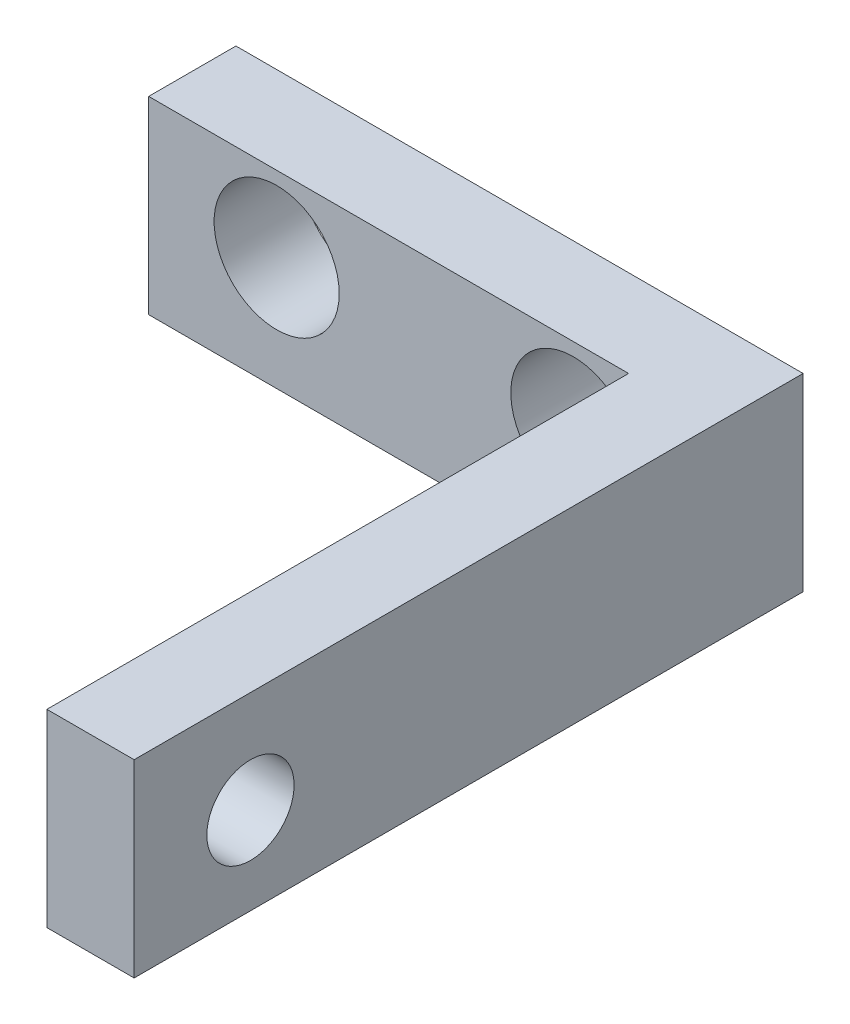
ISO-10303-21;
HEADER;
FILE_DESCRIPTION(('STEP AP214'),'2;1');
FILE_NAME('part.step','',(''),(''),'','','');
FILE_SCHEMA(('AUTOMOTIVE_DESIGN { 1 0 10303 214 1 1 1 1 }'));
ENDSEC;
DATA;
#1=APPLICATION_CONTEXT('core data for automotive mechanical design processes');
#2=APPLICATION_PROTOCOL_DEFINITION('international standard','automotive_design',2000,#1);
#3=PRODUCT_CONTEXT('',#1,'mechanical');
#4=PRODUCT('Part','Part','',(#3));
#5=PRODUCT_RELATED_PRODUCT_CATEGORY('part','',(#4));
#6=PRODUCT_DEFINITION_FORMATION('','',#4);
#7=PRODUCT_DEFINITION_CONTEXT('part definition',#1,'design');
#8=PRODUCT_DEFINITION('design','',#6,#7);
#9=PRODUCT_DEFINITION_SHAPE('','',#8);
#10=(LENGTH_UNIT() NAMED_UNIT(*) SI_UNIT(.MILLI.,.METRE.));
#11=(NAMED_UNIT(*) PLANE_ANGLE_UNIT() SI_UNIT($,.RADIAN.));
#12=(NAMED_UNIT(*) SI_UNIT($,.STERADIAN.) SOLID_ANGLE_UNIT());
#13=UNCERTAINTY_MEASURE_WITH_UNIT(LENGTH_MEASURE(1.E-05),#10,'distance_accuracy_value','');
#14=(GEOMETRIC_REPRESENTATION_CONTEXT(3) GLOBAL_UNCERTAINTY_ASSIGNED_CONTEXT((#13)) GLOBAL_UNIT_ASSIGNED_CONTEXT((#10,
#11,#12)) REPRESENTATION_CONTEXT('',''));
#15=CARTESIAN_POINT('',(0.,0.,0.));
#16=DIRECTION('',(0.,0.,1.));
#17=DIRECTION('',(1.,0.,0.));
#18=AXIS2_PLACEMENT_3D('',#15,#16,#17);
#19=CARTESIAN_POINT('',(30.884573854096,-17.758812852561,23.));
#20=DIRECTION('',(1.,0.,0.));
#21=DIRECTION('',(0.,1.,0.));
#22=AXIS2_PLACEMENT_3D('',#19,#20,#21);
#23=PLANE('',#22);
#24=CARTESIAN_POINT('',(30.884573854096,-21.258812852561,19.));
#25=DIRECTION('',(-1.,0.,0.));
#26=DIRECTION('',(0.,-1.,0.));
#27=AXIS2_PLACEMENT_3D('',#24,#25,#26);
#28=CIRCLE('',#27,1.5);
#29=CARTESIAN_POINT('',(30.884573854096,-22.758812852561,19.));
#30=VERTEX_POINT('',#29);
#31=EDGE_CURVE('E218',#30,#30,#28,.T.);
#32=ORIENTED_EDGE('',*,*,#31,.F.);
#33=EDGE_LOOP('',(#32));
#34=FACE_BOUND('',#33,.T.);
#35=DIRECTION('',(0.,-1.,0.));
#36=VECTOR('',#35,1.);
#37=CARTESIAN_POINT('',(30.884573854096,-17.758812852561,3.));
#38=LINE('',#37,#36);
#39=CARTESIAN_POINT('',(30.884573854096,-17.758812852561,3.));
#40=VERTEX_POINT('',#39);
#41=CARTESIAN_POINT('',(30.884573854096,-18.5556975576235,3.));
#42=VERTEX_POINT('',#41);
#43=EDGE_CURVE('E48',#40,#42,#38,.T.);
#44=ORIENTED_EDGE('',*,*,#43,.T.);
#45=DIRECTION('',(0.,0.,-1.));
#46=VECTOR('',#45,1.);
#47=CARTESIAN_POINT('',(30.884573854096,-18.5556975576235,3.));
#48=LINE('',#47,#46);
#49=CARTESIAN_POINT('',(30.884573854096,-18.5556975576235,13.8814125303952));
#50=VERTEX_POINT('',#49);
#51=EDGE_CURVE('E192',#50,#42,#48,.T.);
#52=ORIENTED_EDGE('',*,*,#51,.F.);
#53=DIRECTION('',(0.,1.,0.));
#54=VECTOR('',#53,1.);
#55=CARTESIAN_POINT('',(30.884573854096,-18.5556975576235,13.8814125303952));
#56=LINE('',#55,#54);
#57=CARTESIAN_POINT('',(30.884573854096,-23.0502804974435,13.8814125303952));
#58=VERTEX_POINT('',#57);
#59=EDGE_CURVE('E195',#58,#50,#56,.T.);
#60=ORIENTED_EDGE('',*,*,#59,.F.);
#61=DIRECTION('',(0.,0.,1.));
#62=VECTOR('',#61,1.);
#63=CARTESIAN_POINT('',(30.884573854096,-23.0502804974435,3.));
#64=LINE('',#63,#62);
#65=CARTESIAN_POINT('',(30.884573854096,-23.0502804974435,3.));
#66=VERTEX_POINT('',#65);
#67=EDGE_CURVE('E200',#66,#58,#64,.T.);
#68=ORIENTED_EDGE('',*,*,#67,.F.);
#69=CARTESIAN_POINT('',(30.884573854096,-24.258812852561,3.));
#70=VERTEX_POINT('',#69);
#71=EDGE_CURVE('E134',#66,#70,#38,.T.);
#72=ORIENTED_EDGE('',*,*,#71,.T.);
#73=DIRECTION('',(0.,0.,-1.));
#74=VECTOR('',#73,1.);
#75=CARTESIAN_POINT('',(30.884573854096,-24.258812852561,23.));
#76=LINE('',#75,#74);
#77=CARTESIAN_POINT('',(30.884573854096,-24.258812852561,23.));
#78=VERTEX_POINT('',#77);
#79=EDGE_CURVE('E98',#78,#70,#76,.T.);
#80=ORIENTED_EDGE('',*,*,#79,.F.);
#81=DIRECTION('',(0.,-1.,0.));
#82=VECTOR('',#81,1.);
#83=CARTESIAN_POINT('',(30.884573854096,-17.758812852561,23.));
#84=LINE('',#83,#82);
#85=CARTESIAN_POINT('',(30.884573854096,-17.758812852561,23.));
#86=VERTEX_POINT('',#85);
#87=EDGE_CURVE('E126',#86,#78,#84,.T.);
#88=ORIENTED_EDGE('',*,*,#87,.F.);
#89=DIRECTION('',(0.,0.,-1.));
#90=VECTOR('',#89,1.);
#91=CARTESIAN_POINT('',(30.884573854096,-17.758812852561,23.));
#92=LINE('',#91,#90);
#93=EDGE_CURVE('E94',#86,#40,#92,.T.);
#94=ORIENTED_EDGE('',*,*,#93,.T.);
#95=EDGE_LOOP('',(#44,#52,#60,#68,#72,#80,#88,#94));
#96=FACE_BOUND('',#95,.T.);
#97=ADVANCED_FACE('F32',(#34,#96),#23,.F.);
#98=CARTESIAN_POINT('',(14.384573854096,-17.758812852561,3.));
#99=DIRECTION('',(1.,0.,0.));
#100=DIRECTION('',(0.,0.,-1.));
#101=AXIS2_PLACEMENT_3D('',#98,#99,#100);
#102=PLANE('',#101);
#103=DIRECTION('',(0.,-1.,0.));
#104=VECTOR('',#103,1.);
#105=CARTESIAN_POINT('',(14.384573854096,-17.758812852561,0.));
#106=LINE('',#105,#104);
#107=CARTESIAN_POINT('',(14.384573854096,-17.758812852561,0.));
#108=VERTEX_POINT('',#107);
#109=CARTESIAN_POINT('',(14.384573854096,-24.258812852561,0.));
#110=VERTEX_POINT('',#109);
#111=EDGE_CURVE('E90',#108,#110,#106,.T.);
#112=ORIENTED_EDGE('',*,*,#111,.T.);
#113=DIRECTION('',(0.,0.,-1.));
#114=VECTOR('',#113,1.);
#115=CARTESIAN_POINT('',(14.384573854096,-24.258812852561,3.));
#116=LINE('',#115,#114);
#117=CARTESIAN_POINT('',(14.384573854096,-24.258812852561,3.));
#118=VERTEX_POINT('',#117);
#119=EDGE_CURVE('E11',#118,#110,#116,.T.);
#120=ORIENTED_EDGE('',*,*,#119,.F.);
#121=DIRECTION('',(0.,-1.,0.));
#122=VECTOR('',#121,1.);
#123=CARTESIAN_POINT('',(14.384573854096,-17.758812852561,3.));
#124=LINE('',#123,#122);
#125=CARTESIAN_POINT('',(14.384573854096,-17.758812852561,3.));
#126=VERTEX_POINT('',#125);
#127=EDGE_CURVE('E84',#126,#118,#124,.T.);
#128=ORIENTED_EDGE('',*,*,#127,.F.);
#129=DIRECTION('',(0.,0.,-1.));
#130=VECTOR('',#129,1.);
#131=CARTESIAN_POINT('',(14.384573854096,-17.758812852561,3.));
#132=LINE('',#131,#130);
#133=EDGE_CURVE('E76',#126,#108,#132,.T.);
#134=ORIENTED_EDGE('',*,*,#133,.T.);
#135=EDGE_LOOP('',(#112,#120,#128,#134));
#136=FACE_BOUND('',#135,.T.);
#137=ADVANCED_FACE('F34',(#136),#102,.F.);
#138=CARTESIAN_POINT('',(14.384573854096,-24.258812852561,3.));
#139=DIRECTION('',(0.,1.,0.));
#140=DIRECTION('',(0.,0.,1.));
#141=AXIS2_PLACEMENT_3D('',#138,#139,#140);
#142=PLANE('',#141);
#143=DIRECTION('',(1.,0.,0.));
#144=VECTOR('',#143,1.);
#145=CARTESIAN_POINT('',(14.384573854096,-24.258812852561,0.));
#146=LINE('',#145,#144);
#147=CARTESIAN_POINT('',(33.884573854096,-24.258812852561,0.));
#148=VERTEX_POINT('',#147);
#149=EDGE_CURVE('E93',#110,#148,#146,.T.);
#150=ORIENTED_EDGE('',*,*,#149,.T.);
#151=DIRECTION('',(0.,0.,-1.));
#152=VECTOR('',#151,1.);
#153=CARTESIAN_POINT('',(33.884573854096,-24.258812852561,3.));
#154=LINE('',#153,#152);
#155=CARTESIAN_POINT('',(33.884573854096,-24.258812852561,23.));
#156=VERTEX_POINT('',#155);
#157=EDGE_CURVE('E41',#156,#148,#154,.T.);
#158=ORIENTED_EDGE('',*,*,#157,.F.);
#159=DIRECTION('',(1.,0.,0.));
#160=VECTOR('',#159,1.);
#161=CARTESIAN_POINT('',(33.884573854096,-24.258812852561,23.));
#162=LINE('',#161,#160);
#163=EDGE_CURVE('E118',#78,#156,#162,.T.);
#164=ORIENTED_EDGE('',*,*,#163,.F.);
#165=ORIENTED_EDGE('',*,*,#79,.T.);
#166=DIRECTION('',(1.,0.,0.));
#167=VECTOR('',#166,1.);
#168=CARTESIAN_POINT('',(14.384573854096,-24.258812852561,3.));
#169=LINE('',#168,#167);
#170=EDGE_CURVE('E136',#118,#70,#169,.T.);
#171=ORIENTED_EDGE('',*,*,#170,.F.);
#172=ORIENTED_EDGE('',*,*,#119,.T.);
#173=EDGE_LOOP('',(#150,#158,#164,#165,#171,#172));
#174=FACE_BOUND('',#173,.T.);
#175=ADVANCED_FACE('F115',(#174),#142,.F.);
#176=CARTESIAN_POINT('',(33.884573854096,-17.758812852561,3.));
#177=DIRECTION('',(-1.,0.,0.));
#178=DIRECTION('',(0.,0.,1.));
#179=AXIS2_PLACEMENT_3D('',#176,#177,#178);
#180=PLANE('',#179);
#181=CARTESIAN_POINT('',(33.884573854096,-21.258812852561,19.));
#182=DIRECTION('',(-1.,0.,0.));
#183=DIRECTION('',(0.,0.,1.));
#184=AXIS2_PLACEMENT_3D('',#181,#182,#183);
#185=CIRCLE('',#184,1.5);
#186=CARTESIAN_POINT('',(33.884573854096,-21.258812852561,20.5));
#187=VERTEX_POINT('',#186);
#188=EDGE_CURVE('E221',#187,#187,#185,.T.);
#189=ORIENTED_EDGE('',*,*,#188,.T.);
#190=EDGE_LOOP('',(#189));
#191=FACE_BOUND('',#190,.T.);
#192=DIRECTION('',(0.,1.,0.));
#193=VECTOR('',#192,1.);
#194=CARTESIAN_POINT('',(33.884573854096,-17.758812852561,0.));
#195=LINE('',#194,#193);
#196=CARTESIAN_POINT('',(33.884573854096,-17.758812852561,0.));
#197=VERTEX_POINT('',#196);
#198=EDGE_CURVE('E85',#148,#197,#195,.T.);
#199=ORIENTED_EDGE('',*,*,#198,.T.);
#200=DIRECTION('',(0.,0.,-1.));
#201=VECTOR('',#200,1.);
#202=CARTESIAN_POINT('',(33.884573854096,-17.758812852561,3.));
#203=LINE('',#202,#201);
#204=CARTESIAN_POINT('',(33.884573854096,-17.758812852561,23.));
#205=VERTEX_POINT('',#204);
#206=EDGE_CURVE('E80',#205,#197,#203,.T.);
#207=ORIENTED_EDGE('',*,*,#206,.F.);
#208=DIRECTION('',(0.,1.,0.));
#209=VECTOR('',#208,1.);
#210=CARTESIAN_POINT('',(33.884573854096,-17.758812852561,23.));
#211=LINE('',#210,#209);
#212=EDGE_CURVE('E111',#156,#205,#211,.T.);
#213=ORIENTED_EDGE('',*,*,#212,.F.);
#214=ORIENTED_EDGE('',*,*,#157,.T.);
#215=EDGE_LOOP('',(#199,#207,#213,#214));
#216=FACE_BOUND('',#215,.T.);
#217=ADVANCED_FACE('F109',(#191,#216),#180,.F.);
#218=CARTESIAN_POINT('',(14.384573854096,-17.758812852561,3.));
#219=DIRECTION('',(0.,-1.,0.));
#220=DIRECTION('',(0.,0.,-1.));
#221=AXIS2_PLACEMENT_3D('',#218,#219,#220);
#222=PLANE('',#221);
#223=DIRECTION('',(-1.,0.,0.));
#224=VECTOR('',#223,1.);
#225=CARTESIAN_POINT('',(14.384573854096,-17.758812852561,0.));
#226=LINE('',#225,#224);
#227=EDGE_CURVE('E73',#197,#108,#226,.T.);
#228=ORIENTED_EDGE('',*,*,#227,.T.);
#229=ORIENTED_EDGE('',*,*,#133,.F.);
#230=DIRECTION('',(-1.,0.,0.));
#231=VECTOR('',#230,1.);
#232=CARTESIAN_POINT('',(14.384573854096,-17.758812852561,3.));
#233=LINE('',#232,#231);
#234=EDGE_CURVE('E53',#40,#126,#233,.T.);
#235=ORIENTED_EDGE('',*,*,#234,.F.);
#236=ORIENTED_EDGE('',*,*,#93,.F.);
#237=DIRECTION('',(-1.,0.,0.));
#238=VECTOR('',#237,1.);
#239=CARTESIAN_POINT('',(33.884573854096,-17.758812852561,23.));
#240=LINE('',#239,#238);
#241=EDGE_CURVE('E130',#205,#86,#240,.T.);
#242=ORIENTED_EDGE('',*,*,#241,.F.);
#243=ORIENTED_EDGE('',*,*,#206,.T.);
#244=EDGE_LOOP('',(#228,#229,#235,#236,#242,#243));
#245=FACE_BOUND('',#244,.T.);
#246=ADVANCED_FACE('F75',(#245),#222,.F.);
#247=CARTESIAN_POINT('',(0.,0.,3.));
#248=DIRECTION('',(0.,0.,1.));
#249=DIRECTION('',(1.,0.,0.));
#250=AXIS2_PLACEMENT_3D('',#247,#248,#249);
#251=PLANE('',#250);
#252=CARTESIAN_POINT('',(28.984573854096,-20.358812852561,3.));
#253=DIRECTION('',(0.,0.,1.));
#254=DIRECTION('',(1.,0.,0.));
#255=AXIS2_PLACEMENT_3D('',#252,#253,#254);
#256=CIRCLE('',#255,2.15);
#257=CARTESIAN_POINT('',(31.134573854096,-20.358812852561,3.));
#258=VERTEX_POINT('',#257);
#259=EDGE_CURVE('E206',#258,#258,#256,.F.);
#260=ORIENTED_EDGE('',*,*,#259,.T.);
#261=EDGE_LOOP('',(#260));
#262=FACE_BOUND('',#261,.T.);
#263=CARTESIAN_POINT('',(18.784573854096,-20.358812852561,3.));
#264=DIRECTION('',(0.,0.,1.));
#265=DIRECTION('',(1.,0.,0.));
#266=AXIS2_PLACEMENT_3D('',#263,#264,#265);
#267=CIRCLE('',#266,2.15);
#268=CARTESIAN_POINT('',(20.934573854096,-20.358812852561,3.));
#269=VERTEX_POINT('',#268);
#270=EDGE_CURVE('E215',#269,#269,#267,.F.);
#271=ORIENTED_EDGE('',*,*,#270,.T.);
#272=EDGE_LOOP('',(#271));
#273=FACE_BOUND('',#272,.T.);
#274=ORIENTED_EDGE('',*,*,#71,.F.);
#275=DIRECTION('',(-1.,0.,0.));
#276=VECTOR('',#275,1.);
#277=CARTESIAN_POINT('',(31.884573854096,-23.0502804974435,3.));
#278=LINE('',#277,#276);
#279=CARTESIAN_POINT('',(31.884573854096,-23.0502804974435,3.));
#280=VERTEX_POINT('',#279);
#281=EDGE_CURVE('E172',#280,#66,#278,.T.);
#282=ORIENTED_EDGE('',*,*,#281,.F.);
#283=DIRECTION('',(0.,-1.,0.));
#284=VECTOR('',#283,1.);
#285=CARTESIAN_POINT('',(31.884573854096,-18.5556975576235,3.));
#286=LINE('',#285,#284);
#287=CARTESIAN_POINT('',(31.884573854096,-18.5556975576235,3.));
#288=VERTEX_POINT('',#287);
#289=EDGE_CURVE('E175',#288,#280,#286,.T.);
#290=ORIENTED_EDGE('',*,*,#289,.F.);
#291=DIRECTION('',(-1.,0.,0.));
#292=VECTOR('',#291,1.);
#293=CARTESIAN_POINT('',(31.884573854096,-18.5556975576235,3.));
#294=LINE('',#293,#292);
#295=EDGE_CURVE('E204',#288,#42,#294,.T.);
#296=ORIENTED_EDGE('',*,*,#295,.T.);
#297=ORIENTED_EDGE('',*,*,#43,.F.);
#298=ORIENTED_EDGE('',*,*,#234,.T.);
#299=ORIENTED_EDGE('',*,*,#127,.T.);
#300=ORIENTED_EDGE('',*,*,#170,.T.);
#301=EDGE_LOOP('',(#274,#282,#290,#296,#297,#298,#299,#300));
#302=FACE_BOUND('',#301,.T.);
#303=ADVANCED_FACE('F140',(#262,#273,#302),#251,.T.);
#304=CARTESIAN_POINT('',(0.,0.,0.));
#305=DIRECTION('',(0.,0.,1.));
#306=DIRECTION('',(1.,0.,0.));
#307=AXIS2_PLACEMENT_3D('',#304,#305,#306);
#308=PLANE('',#307);
#309=CARTESIAN_POINT('',(28.984573854096,-20.358812852561,0.));
#310=DIRECTION('',(0.,0.,1.));
#311=DIRECTION('',(1.,0.,0.));
#312=AXIS2_PLACEMENT_3D('',#309,#310,#311);
#313=CIRCLE('',#312,2.15);
#314=CARTESIAN_POINT('',(31.134573854096,-20.358812852561,0.));
#315=VERTEX_POINT('',#314);
#316=EDGE_CURVE('E212',#315,#315,#313,.F.);
#317=ORIENTED_EDGE('',*,*,#316,.F.);
#318=EDGE_LOOP('',(#317));
#319=FACE_BOUND('',#318,.T.);
#320=CARTESIAN_POINT('',(18.784573854096,-20.358812852561,0.));
#321=DIRECTION('',(0.,0.,1.));
#322=DIRECTION('',(1.,0.,0.));
#323=AXIS2_PLACEMENT_3D('',#320,#321,#322);
#324=CIRCLE('',#323,2.15);
#325=CARTESIAN_POINT('',(20.934573854096,-20.358812852561,0.));
#326=VERTEX_POINT('',#325);
#327=EDGE_CURVE('E36',#326,#326,#324,.F.);
#328=ORIENTED_EDGE('',*,*,#327,.F.);
#329=EDGE_LOOP('',(#328));
#330=FACE_BOUND('',#329,.T.);
#331=ORIENTED_EDGE('',*,*,#111,.F.);
#332=ORIENTED_EDGE('',*,*,#227,.F.);
#333=ORIENTED_EDGE('',*,*,#198,.F.);
#334=ORIENTED_EDGE('',*,*,#149,.F.);
#335=EDGE_LOOP('',(#331,#332,#333,#334));
#336=FACE_BOUND('',#335,.T.);
#337=ADVANCED_FACE('F92',(#319,#330,#336),#308,.F.);
#338=CARTESIAN_POINT('',(0.,0.,23.));
#339=DIRECTION('',(0.,0.,-1.));
#340=DIRECTION('',(-1.,0.,0.));
#341=AXIS2_PLACEMENT_3D('',#338,#339,#340);
#342=PLANE('',#341);
#343=ORIENTED_EDGE('',*,*,#212,.T.);
#344=ORIENTED_EDGE('',*,*,#241,.T.);
#345=ORIENTED_EDGE('',*,*,#87,.T.);
#346=ORIENTED_EDGE('',*,*,#163,.T.);
#347=EDGE_LOOP('',(#343,#344,#345,#346));
#348=FACE_BOUND('',#347,.T.);
#349=ADVANCED_FACE('F122',(#348),#342,.F.);
#350=CARTESIAN_POINT('',(40.884573854096,-21.258812852561,19.));
#351=DIRECTION('',(-1.,0.,0.));
#352=DIRECTION('',(0.,-1.,0.));
#353=AXIS2_PLACEMENT_3D('',#350,#351,#352);
#354=CYLINDRICAL_SURFACE('',#353,1.5);
#355=ORIENTED_EDGE('',*,*,#31,.T.);
#356=EDGE_LOOP('',(#355));
#357=FACE_BOUND('',#356,.T.);
#358=ORIENTED_EDGE('',*,*,#188,.F.);
#359=EDGE_LOOP('',(#358));
#360=FACE_BOUND('',#359,.T.);
#361=ADVANCED_FACE('F290',(#357,#360),#354,.F.);
#362=CARTESIAN_POINT('',(28.984573854096,-20.358812852561,13.));
#363=DIRECTION('',(0.,0.,-1.));
#364=DIRECTION('',(-1.,0.,0.));
#365=AXIS2_PLACEMENT_3D('',#362,#363,#364);
#366=CYLINDRICAL_SURFACE('',#365,2.15);
#367=ORIENTED_EDGE('',*,*,#259,.F.);
#368=EDGE_LOOP('',(#367));
#369=FACE_BOUND('',#368,.T.);
#370=ORIENTED_EDGE('',*,*,#316,.T.);
#371=EDGE_LOOP('',(#370));
#372=FACE_BOUND('',#371,.T.);
#373=ADVANCED_FACE('F295',(#369,#372),#366,.F.);
#374=CARTESIAN_POINT('',(18.784573854096,-20.358812852561,13.));
#375=DIRECTION('',(0.,0.,-1.));
#376=DIRECTION('',(-1.,0.,0.));
#377=AXIS2_PLACEMENT_3D('',#374,#375,#376);
#378=CYLINDRICAL_SURFACE('',#377,2.15);
#379=ORIENTED_EDGE('',*,*,#270,.F.);
#380=EDGE_LOOP('',(#379));
#381=FACE_BOUND('',#380,.T.);
#382=ORIENTED_EDGE('',*,*,#327,.T.);
#383=EDGE_LOOP('',(#382));
#384=FACE_BOUND('',#383,.T.);
#385=ADVANCED_FACE('F238',(#381,#384),#378,.F.);
#386=CARTESIAN_POINT('',(31.884573854096,-18.5556975576235,3.));
#387=DIRECTION('',(0.,1.,0.));
#388=DIRECTION('',(-1.,0.,0.));
#389=AXIS2_PLACEMENT_3D('',#386,#387,#388);
#390=PLANE('',#389);
#391=ORIENTED_EDGE('',*,*,#51,.T.);
#392=ORIENTED_EDGE('',*,*,#295,.F.);
#393=DIRECTION('',(0.,0.,-1.));
#394=VECTOR('',#393,1.);
#395=CARTESIAN_POINT('',(31.884573854096,-18.5556975576235,3.));
#396=LINE('',#395,#394);
#397=CARTESIAN_POINT('',(31.884573854096,-18.5556975576235,13.8814125303952));
#398=VERTEX_POINT('',#397);
#399=EDGE_CURVE('E180',#398,#288,#396,.T.);
#400=ORIENTED_EDGE('',*,*,#399,.F.);
#401=DIRECTION('',(-1.,0.,0.));
#402=VECTOR('',#401,1.);
#403=CARTESIAN_POINT('',(31.884573854096,-18.5556975576235,13.8814125303952));
#404=LINE('',#403,#402);
#405=EDGE_CURVE('E207',#398,#50,#404,.T.);
#406=ORIENTED_EDGE('',*,*,#405,.T.);
#407=EDGE_LOOP('',(#391,#392,#400,#406));
#408=FACE_BOUND('',#407,.T.);
#409=ADVANCED_FACE('F228',(#408),#390,.F.);
#410=CARTESIAN_POINT('',(31.884573854096,-18.5556975576235,13.8814125303952));
#411=DIRECTION('',(0.,0.,1.));
#412=DIRECTION('',(1.,0.,0.));
#413=AXIS2_PLACEMENT_3D('',#410,#411,#412);
#414=PLANE('',#413);
#415=ORIENTED_EDGE('',*,*,#59,.T.);
#416=ORIENTED_EDGE('',*,*,#405,.F.);
#417=DIRECTION('',(0.,1.,0.));
#418=VECTOR('',#417,1.);
#419=CARTESIAN_POINT('',(31.884573854096,-18.5556975576235,13.8814125303952));
#420=LINE('',#419,#418);
#421=CARTESIAN_POINT('',(31.884573854096,-23.0502804974435,13.8814125303952));
#422=VERTEX_POINT('',#421);
#423=EDGE_CURVE('E188',#422,#398,#420,.T.);
#424=ORIENTED_EDGE('',*,*,#423,.F.);
#425=DIRECTION('',(-1.,0.,0.));
#426=VECTOR('',#425,1.);
#427=CARTESIAN_POINT('',(31.884573854096,-23.0502804974435,13.8814125303952));
#428=LINE('',#427,#426);
#429=EDGE_CURVE('E179',#422,#58,#428,.T.);
#430=ORIENTED_EDGE('',*,*,#429,.T.);
#431=EDGE_LOOP('',(#415,#416,#424,#430));
#432=FACE_BOUND('',#431,.T.);
#433=ADVANCED_FACE('F230',(#432),#414,.F.);
#434=CARTESIAN_POINT('',(31.884573854096,-23.0502804974435,3.));
#435=DIRECTION('',(0.,-1.,0.));
#436=DIRECTION('',(1.,0.,0.));
#437=AXIS2_PLACEMENT_3D('',#434,#435,#436);
#438=PLANE('',#437);
#439=ORIENTED_EDGE('',*,*,#67,.T.);
#440=ORIENTED_EDGE('',*,*,#429,.F.);
#441=DIRECTION('',(0.,0.,1.));
#442=VECTOR('',#441,1.);
#443=CARTESIAN_POINT('',(31.884573854096,-23.0502804974435,3.));
#444=LINE('',#443,#442);
#445=EDGE_CURVE('E183',#280,#422,#444,.T.);
#446=ORIENTED_EDGE('',*,*,#445,.F.);
#447=ORIENTED_EDGE('',*,*,#281,.T.);
#448=EDGE_LOOP('',(#439,#440,#446,#447));
#449=FACE_BOUND('',#448,.T.);
#450=ADVANCED_FACE('F184',(#449),#438,.F.);
#451=CARTESIAN_POINT('',(31.884573854096,0.,0.));
#452=DIRECTION('',(-1.,0.,0.));
#453=DIRECTION('',(0.,-1.,0.));
#454=AXIS2_PLACEMENT_3D('',#451,#452,#453);
#455=PLANE('',#454);
#456=ORIENTED_EDGE('',*,*,#289,.T.);
#457=ORIENTED_EDGE('',*,*,#445,.T.);
#458=ORIENTED_EDGE('',*,*,#423,.T.);
#459=ORIENTED_EDGE('',*,*,#399,.T.);
#460=EDGE_LOOP('',(#456,#457,#458,#459));
#461=FACE_BOUND('',#460,.T.);
#462=ADVANCED_FACE('F190',(#461),#455,.T.);
#463=CLOSED_SHELL('',(#97,#137,#175,#217,#246,#303,#337,#349,#361,#373,#385,#409,#433,#450,#462));
#464=MANIFOLD_SOLID_BREP('B2',#463);
#465=ADVANCED_BREP_SHAPE_REPRESENTATION('',(#18,#464),#14);
#466=SHAPE_DEFINITION_REPRESENTATION(#9,#465);
ENDSEC;
END-ISO-10303-21;
